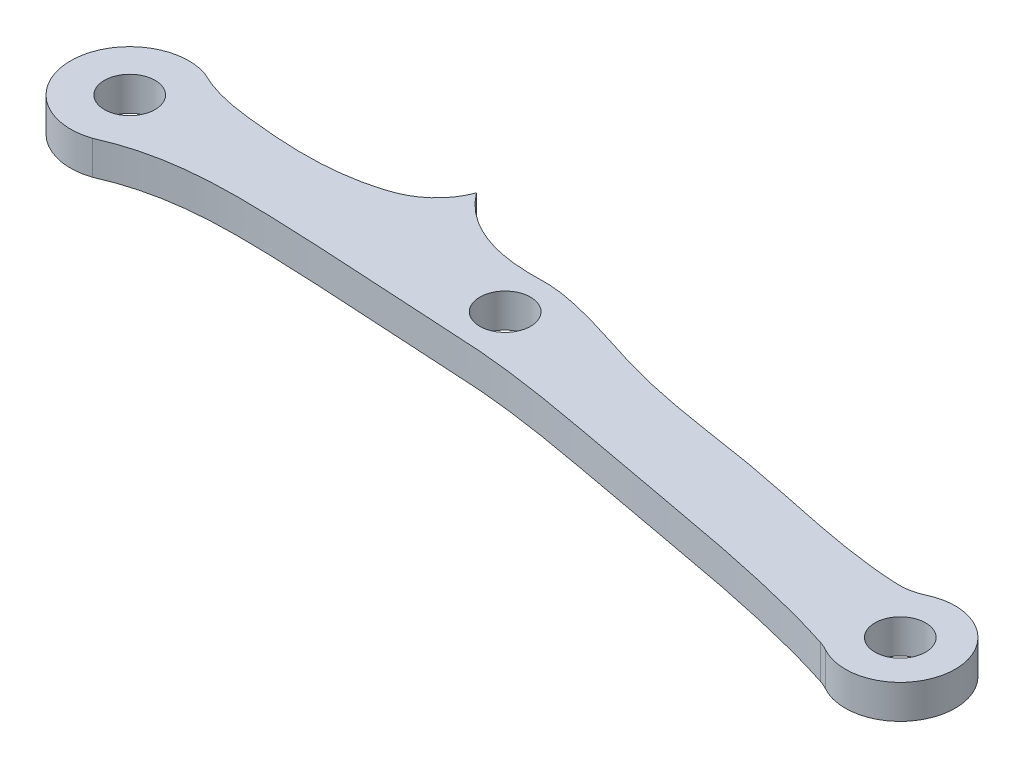
ISO-10303-21;
HEADER;
FILE_DESCRIPTION(('STEP AP214'),'2;1');
FILE_NAME('part.step','',(''),(''),'','','');
FILE_SCHEMA(('AUTOMOTIVE_DESIGN { 1 0 10303 214 1 1 1 1 }'));
ENDSEC;
DATA;
#1=APPLICATION_CONTEXT('core data for automotive mechanical design processes');
#2=APPLICATION_PROTOCOL_DEFINITION('international standard','automotive_design',2000,#1);
#3=PRODUCT_CONTEXT('',#1,'mechanical');
#4=PRODUCT('Part','Part','',(#3));
#5=PRODUCT_RELATED_PRODUCT_CATEGORY('part','',(#4));
#6=PRODUCT_DEFINITION_FORMATION('','',#4);
#7=PRODUCT_DEFINITION_CONTEXT('part definition',#1,'design');
#8=PRODUCT_DEFINITION('design','',#6,#7);
#9=PRODUCT_DEFINITION_SHAPE('','',#8);
#10=(LENGTH_UNIT() NAMED_UNIT(*) SI_UNIT(.MILLI.,.METRE.));
#11=(NAMED_UNIT(*) PLANE_ANGLE_UNIT() SI_UNIT($,.RADIAN.));
#12=(NAMED_UNIT(*) SI_UNIT($,.STERADIAN.) SOLID_ANGLE_UNIT());
#13=UNCERTAINTY_MEASURE_WITH_UNIT(LENGTH_MEASURE(1.E-05),#10,'distance_accuracy_value','');
#14=(GEOMETRIC_REPRESENTATION_CONTEXT(3) GLOBAL_UNCERTAINTY_ASSIGNED_CONTEXT((#13)) GLOBAL_UNIT_ASSIGNED_CONTEXT((#10,
#11,#12)) REPRESENTATION_CONTEXT('',''));
#15=CARTESIAN_POINT('',(0.,0.,0.));
#16=DIRECTION('',(0.,0.,1.));
#17=DIRECTION('',(1.,0.,0.));
#18=AXIS2_PLACEMENT_3D('',#15,#16,#17);
#19=CARTESIAN_POINT('',(0.,20.,0.));
#20=DIRECTION('',(0.,-1.,0.));
#21=DIRECTION('',(0.,0.,-1.));
#22=AXIS2_PLACEMENT_3D('',#19,#20,#21);
#23=CYLINDRICAL_SURFACE('',#22,35.);
#24=CARTESIAN_POINT('',(0.,0.,0.));
#25=DIRECTION('',(0.,1.,0.));
#26=DIRECTION('',(0.,0.,1.));
#27=AXIS2_PLACEMENT_3D('',#24,#25,#26);
#28=CIRCLE('',#27,35.);
#29=CARTESIAN_POINT('',(11.2278449220897,0.,-33.1501960538019));
#30=VERTEX_POINT('',#29);
#31=CARTESIAN_POINT('',(11.2278449220897,0.,33.1501960538019));
#32=VERTEX_POINT('',#31);
#33=EDGE_CURVE('E219',#30,#32,#28,.T.);
#34=ORIENTED_EDGE('',*,*,#33,.T.);
#35=DIRECTION('',(0.,-1.,0.));
#36=VECTOR('',#35,1.);
#37=CARTESIAN_POINT('',(11.2278449220897,20.,33.1501960538019));
#38=LINE('',#37,#36);
#39=CARTESIAN_POINT('',(11.2278449220897,20.,33.1501960538019));
#40=VERTEX_POINT('',#39);
#41=EDGE_CURVE('E11',#40,#32,#38,.T.);
#42=ORIENTED_EDGE('',*,*,#41,.F.);
#43=CARTESIAN_POINT('',(0.,20.,0.));
#44=DIRECTION('',(0.,1.,0.));
#45=DIRECTION('',(0.,0.,1.));
#46=AXIS2_PLACEMENT_3D('',#43,#44,#45);
#47=CIRCLE('',#46,35.);
#48=CARTESIAN_POINT('',(11.2278449220897,20.,-33.1501960538019));
#49=VERTEX_POINT('',#48);
#50=EDGE_CURVE('E181',#49,#40,#47,.T.);
#51=ORIENTED_EDGE('',*,*,#50,.F.);
#52=DIRECTION('',(0.,-1.,0.));
#53=VECTOR('',#52,1.);
#54=CARTESIAN_POINT('',(11.2278449220897,20.,-33.1501960538019));
#55=LINE('',#54,#53);
#56=EDGE_CURVE('E65',#49,#30,#55,.T.);
#57=ORIENTED_EDGE('',*,*,#56,.T.);
#58=EDGE_LOOP('',(#34,#42,#51,#57));
#59=FACE_BOUND('',#58,.T.);
#60=ADVANCED_FACE('F47',(#59),#23,.T.);
#61=CARTESIAN_POINT('',(11.2278449220897,20.,33.1501960538019));
#62=CARTESIAN_POINT('',(41.4167565536691,20.,19.5458087174127));
#63=CARTESIAN_POINT('',(109.617018014727,20.,19.5943513866573));
#64=CARTESIAN_POINT('',(185.82372038496,20.,25.1065613653826));
#65=CARTESIAN_POINT('',(260.889286260654,20.,28.7263373929466));
#66=CARTESIAN_POINT('',(314.998938133145,20.,40.1034737505354));
#67=CARTESIAN_POINT('',(397.029783507844,20.,54.5301468518699));
#68=CARTESIAN_POINT('',(449.771483959378,20.,64.7244108950254));
#69=CARTESIAN_POINT('',(484.590684969114,20.,76.1256831889839));
#70=B_SPLINE_CURVE_WITH_KNOTS('',3,(#61,#62,#63,#64,#65,#66,#67,#68,#69),.UNSPECIFIED.,.F.,.F.,
(4,1,1,1,1,1,4),(0.,0.199281033354488,0.40819670319934,0.458288105144164,0.673316503062886,
0.728275547660917,0.981000001384637),.UNSPECIFIED.);
#71=DIRECTION('',(0.,-1.,0.));
#72=VECTOR('',#71,1.);
#73=SURFACE_OF_LINEAR_EXTRUSION('',#70,#72);
#74=CARTESIAN_POINT('',(11.2278449220897,0.,33.1501960538019));
#75=CARTESIAN_POINT('',(41.4167565536691,0.,19.5458087174127));
#76=CARTESIAN_POINT('',(109.617018014727,0.,19.5943513866573));
#77=CARTESIAN_POINT('',(185.82372038496,0.,25.1065613653826));
#78=CARTESIAN_POINT('',(260.889286260654,0.,28.7263373929466));
#79=CARTESIAN_POINT('',(314.998938133145,0.,40.1034737505354));
#80=CARTESIAN_POINT('',(397.029783507844,0.,54.5301468518699));
#81=CARTESIAN_POINT('',(449.771483959378,0.,64.7244108950254));
#82=CARTESIAN_POINT('',(484.590684969114,0.,76.1256831889839));
#83=B_SPLINE_CURVE_WITH_KNOTS('',3,(#74,#75,#76,#77,#78,#79,#80,#81,#82),.UNSPECIFIED.,.F.,.F.,
(4,1,1,1,1,1,4),(0.,0.199281033354488,0.40819670319934,0.458288105144164,0.673316503062886,
0.728275547660917,0.981000001384637),.UNSPECIFIED.);
#84=CARTESIAN_POINT('',(484.590684969114,0.,76.125683188984));
#85=VERTEX_POINT('',#84);
#86=EDGE_CURVE('E216',#32,#85,#83,.T.);
#87=ORIENTED_EDGE('',*,*,#86,.T.);
#88=DIRECTION('',(0.,-1.,0.));
#89=VECTOR('',#88,1.);
#90=CARTESIAN_POINT('',(484.590684969114,20.,76.125683188984));
#91=LINE('',#90,#89);
#92=CARTESIAN_POINT('',(484.590684969114,20.,76.125683188984));
#93=VERTEX_POINT('',#92);
#94=EDGE_CURVE('E57',#93,#85,#91,.T.);
#95=ORIENTED_EDGE('',*,*,#94,.F.);
#96=EDGE_CURVE('E100',#40,#93,#70,.T.);
#97=ORIENTED_EDGE('',*,*,#96,.F.);
#98=ORIENTED_EDGE('',*,*,#41,.T.);
#99=EDGE_LOOP('',(#87,#95,#97,#98));
#100=FACE_BOUND('',#99,.T.);
#101=ADVANCED_FACE('F168',(#100),#73,.F.);
#102=CARTESIAN_POINT('',(475.25515154402,20.,104.636169254096));
#103=DIRECTION('',(0.,-1.,0.));
#104=DIRECTION('',(0.,0.,-1.));
#105=AXIS2_PLACEMENT_3D('',#102,#103,#104);
#106=CYLINDRICAL_SURFACE('',#105,30.);
#107=CARTESIAN_POINT('',(475.25515154402,0.,104.636169254096));
#108=DIRECTION('',(0.,1.,0.));
#109=DIRECTION('',(0.,0.,1.));
#110=AXIS2_PLACEMENT_3D('',#107,#108,#109);
#111=CIRCLE('',#110,30.);
#112=CARTESIAN_POINT('',(489.832502579298,0.,78.4159320928065));
#113=VERTEX_POINT('',#112);
#114=EDGE_CURVE('E213',#85,#113,#111,.F.);
#115=ORIENTED_EDGE('',*,*,#114,.T.);
#116=DIRECTION('',(0.,-1.,0.));
#117=VECTOR('',#116,1.);
#118=CARTESIAN_POINT('',(489.832502579298,20.,78.4159320928065));
#119=LINE('',#118,#117);
#120=CARTESIAN_POINT('',(489.832502579298,20.,78.4159320928065));
#121=VERTEX_POINT('',#120);
#122=EDGE_CURVE('E257',#121,#113,#119,.T.);
#123=ORIENTED_EDGE('',*,*,#122,.F.);
#124=CARTESIAN_POINT('',(475.25515154402,20.,104.636169254096));
#125=DIRECTION('',(0.,1.,0.));
#126=DIRECTION('',(0.,0.,1.));
#127=AXIS2_PLACEMENT_3D('',#124,#125,#126);
#128=CIRCLE('',#127,30.);
#129=EDGE_CURVE('E180',#93,#121,#128,.F.);
#130=ORIENTED_EDGE('',*,*,#129,.F.);
#131=ORIENTED_EDGE('',*,*,#94,.T.);
#132=EDGE_LOOP('',(#115,#123,#130,#131));
#133=FACE_BOUND('',#132,.T.);
#134=ADVANCED_FACE('F164',(#133),#106,.F.);
#135=CARTESIAN_POINT('',(505.624632867516,20.,50.010675168076));
#136=DIRECTION('',(0.,-1.,0.));
#137=DIRECTION('',(0.,0.,-1.));
#138=AXIS2_PLACEMENT_3D('',#135,#136,#137);
#139=CYLINDRICAL_SURFACE('',#138,32.4999999999999);
#140=CARTESIAN_POINT('',(505.624632867516,0.,50.010675168076));
#141=DIRECTION('',(0.,1.,0.));
#142=DIRECTION('',(0.,0.,1.));
#143=AXIS2_PLACEMENT_3D('',#140,#141,#142);
#144=CIRCLE('',#143,32.4999999999999);
#145=CARTESIAN_POINT('',(491.671127052918,0.,20.658508715121));
#146=VERTEX_POINT('',#145);
#147=EDGE_CURVE('E209',#113,#146,#144,.T.);
#148=ORIENTED_EDGE('',*,*,#147,.T.);
#149=DIRECTION('',(0.,-1.,0.));
#150=VECTOR('',#149,1.);
#151=CARTESIAN_POINT('',(491.671127052918,20.,20.658508715121));
#152=LINE('',#151,#150);
#153=CARTESIAN_POINT('',(491.671127052918,20.,20.658508715121));
#154=VERTEX_POINT('',#153);
#155=EDGE_CURVE('E123',#154,#146,#152,.T.);
#156=ORIENTED_EDGE('',*,*,#155,.F.);
#157=CARTESIAN_POINT('',(505.624632867516,20.,50.010675168076));
#158=DIRECTION('',(0.,1.,0.));
#159=DIRECTION('',(0.,0.,1.));
#160=AXIS2_PLACEMENT_3D('',#157,#158,#159);
#161=CIRCLE('',#160,32.4999999999999);
#162=EDGE_CURVE('E131',#121,#154,#161,.T.);
#163=ORIENTED_EDGE('',*,*,#162,.F.);
#164=ORIENTED_EDGE('',*,*,#122,.T.);
#165=EDGE_LOOP('',(#148,#156,#163,#164));
#166=FACE_BOUND('',#165,.T.);
#167=ADVANCED_FACE('F161',(#166),#139,.T.);
#168=CARTESIAN_POINT('',(478.790967839443,20.,-6.43579877991446));
#169=DIRECTION('',(0.,-1.,0.));
#170=DIRECTION('',(0.,0.,-1.));
#171=AXIS2_PLACEMENT_3D('',#168,#169,#170);
#172=CYLINDRICAL_SURFACE('',#171,30.);
#173=CARTESIAN_POINT('',(478.790967839443,0.,-6.43579877991446));
#174=DIRECTION('',(0.,1.,0.));
#175=DIRECTION('',(0.,0.,1.));
#176=AXIS2_PLACEMENT_3D('',#173,#174,#175);
#177=CIRCLE('',#176,30.);
#178=CARTESIAN_POINT('',(477.449535041742,0.,23.534195515201));
#179=VERTEX_POINT('',#178);
#180=EDGE_CURVE('E118',#179,#146,#177,.T.);
#181=ORIENTED_EDGE('',*,*,#180,.F.);
#182=DIRECTION('',(0.,-1.,0.));
#183=VECTOR('',#182,1.);
#184=CARTESIAN_POINT('',(477.449535041742,20.,23.534195515201));
#185=LINE('',#184,#183);
#186=CARTESIAN_POINT('',(477.449535041742,20.,23.534195515201));
#187=VERTEX_POINT('',#186);
#188=EDGE_CURVE('E113',#187,#179,#185,.T.);
#189=ORIENTED_EDGE('',*,*,#188,.F.);
#190=CARTESIAN_POINT('',(478.790967839443,20.,-6.43579877991446));
#191=DIRECTION('',(0.,1.,0.));
#192=DIRECTION('',(0.,0.,1.));
#193=AXIS2_PLACEMENT_3D('',#190,#191,#192);
#194=CIRCLE('',#193,30.);
#195=EDGE_CURVE('E116',#187,#154,#194,.T.);
#196=ORIENTED_EDGE('',*,*,#195,.T.);
#197=ORIENTED_EDGE('',*,*,#155,.T.);
#198=EDGE_LOOP('',(#181,#189,#196,#197));
#199=FACE_BOUND('',#198,.T.);
#200=ADVANCED_FACE('F115',(#199),#172,.F.);
#201=CARTESIAN_POINT('',(152.569978470431,20.,-52.446429487655));
#202=CARTESIAN_POINT('',(169.216290541094,20.,-30.2513467267702));
#203=CARTESIAN_POINT('',(199.499803962065,20.,-25.9854701687068));
#204=CARTESIAN_POINT('',(229.531039992593,20.,-27.5997398322628));
#205=CARTESIAN_POINT('',(258.115601287071,20.,-19.3712572274807));
#206=CARTESIAN_POINT('',(295.678183930158,20.,-6.78542798163519));
#207=CARTESIAN_POINT('',(325.978973640535,20.,-0.976639678659181));
#208=CARTESIAN_POINT('',(396.041080311098,20.,9.06713512549248));
#209=CARTESIAN_POINT('',(440.032342199847,20.,21.8594321107846));
#210=CARTESIAN_POINT('',(477.449535041742,20.,23.534195515201));
#211=B_SPLINE_CURVE_WITH_KNOTS('',3,(#201,#202,#203,#204,#205,#206,#207,#208,#209,#210),
.UNSPECIFIED.,.F.,.F.,(4,1,1,1,1,1,1,4),(0.,0.156649966692074,0.187428866143182,
0.294415646914651,0.33547383172428,0.556952529429845,0.622371723483351,0.961980935046151),.UNSPECIFIED.);
#212=DIRECTION('',(0.,-1.,0.));
#213=VECTOR('',#212,1.);
#214=SURFACE_OF_LINEAR_EXTRUSION('',#211,#213);
#215=CARTESIAN_POINT('',(152.569978470431,0.,-52.446429487655));
#216=CARTESIAN_POINT('',(169.216290541094,0.,-30.2513467267702));
#217=CARTESIAN_POINT('',(199.499803962065,0.,-25.9854701687068));
#218=CARTESIAN_POINT('',(229.531039992593,0.,-27.5997398322628));
#219=CARTESIAN_POINT('',(258.115601287071,0.,-19.3712572274807));
#220=CARTESIAN_POINT('',(295.678183930158,0.,-6.78542798163519));
#221=CARTESIAN_POINT('',(325.978973640535,0.,-0.976639678659181));
#222=CARTESIAN_POINT('',(396.041080311098,0.,9.06713512549248));
#223=CARTESIAN_POINT('',(440.032342199847,0.,21.8594321107846));
#224=CARTESIAN_POINT('',(477.449535041742,0.,23.534195515201));
#225=B_SPLINE_CURVE_WITH_KNOTS('',3,(#215,#216,#217,#218,#219,#220,#221,#222,#223,#224),
.UNSPECIFIED.,.F.,.F.,(4,1,1,1,1,1,1,4),(0.,0.156649966692074,0.187428866143182,
0.294415646914651,0.33547383172428,0.556952529429845,0.622371723483351,0.961980935046151),.UNSPECIFIED.);
#226=CARTESIAN_POINT('',(152.569978470431,0.,-52.4464294876549));
#227=VERTEX_POINT('',#226);
#228=EDGE_CURVE('E204',#227,#179,#225,.T.);
#229=ORIENTED_EDGE('',*,*,#228,.F.);
#230=DIRECTION('',(0.,-1.,0.));
#231=VECTOR('',#230,1.);
#232=CARTESIAN_POINT('',(152.569978470431,20.,-52.4464294876549));
#233=LINE('',#232,#231);
#234=CARTESIAN_POINT('',(152.569978470431,20.,-52.4464294876549));
#235=VERTEX_POINT('',#234);
#236=EDGE_CURVE('E88',#235,#227,#233,.T.);
#237=ORIENTED_EDGE('',*,*,#236,.F.);
#238=EDGE_CURVE('E129',#235,#187,#211,.T.);
#239=ORIENTED_EDGE('',*,*,#238,.T.);
#240=ORIENTED_EDGE('',*,*,#188,.T.);
#241=EDGE_LOOP('',(#229,#237,#239,#240));
#242=FACE_BOUND('',#241,.T.);
#243=ADVANCED_FACE('F135',(#242),#214,.T.);
#244=CARTESIAN_POINT('',(0.,20.,0.));
#245=DIRECTION('',(0.,-1.,0.));
#246=DIRECTION('',(0.,0.,-1.));
#247=AXIS2_PLACEMENT_3D('',#244,#245,#246);
#248=CYLINDRICAL_SURFACE('',#247,15.);
#249=CARTESIAN_POINT('',(0.,20.,0.));
#250=DIRECTION('',(0.,1.,0.));
#251=DIRECTION('',(0.,0.,1.));
#252=AXIS2_PLACEMENT_3D('',#249,#250,#251);
#253=CIRCLE('',#252,15.);
#254=CARTESIAN_POINT('',(0.,20.,15.));
#255=VERTEX_POINT('',#254);
#256=EDGE_CURVE('E190',#255,#255,#253,.T.);
#257=ORIENTED_EDGE('',*,*,#256,.T.);
#258=EDGE_LOOP('',(#257));
#259=FACE_BOUND('',#258,.T.);
#260=CARTESIAN_POINT('',(0.,0.,0.));
#261=DIRECTION('',(0.,1.,0.));
#262=DIRECTION('',(0.,0.,1.));
#263=AXIS2_PLACEMENT_3D('',#260,#261,#262);
#264=CIRCLE('',#263,15.);
#265=CARTESIAN_POINT('',(0.,0.,15.));
#266=VERTEX_POINT('',#265);
#267=EDGE_CURVE('E222',#266,#266,#264,.T.);
#268=ORIENTED_EDGE('',*,*,#267,.F.);
#269=EDGE_LOOP('',(#268));
#270=FACE_BOUND('',#269,.T.);
#271=ADVANCED_FACE('F156',(#259,#270),#248,.F.);
#272=CARTESIAN_POINT('',(222.,20.,0.));
#273=DIRECTION('',(0.,-1.,0.));
#274=DIRECTION('',(0.,0.,-1.));
#275=AXIS2_PLACEMENT_3D('',#272,#273,#274);
#276=CYLINDRICAL_SURFACE('',#275,15.);
#277=CARTESIAN_POINT('',(222.,20.,0.));
#278=DIRECTION('',(0.,1.,0.));
#279=DIRECTION('',(0.,0.,1.));
#280=AXIS2_PLACEMENT_3D('',#277,#278,#279);
#281=CIRCLE('',#280,15.);
#282=CARTESIAN_POINT('',(222.,20.,15.));
#283=VERTEX_POINT('',#282);
#284=EDGE_CURVE('E193',#283,#283,#281,.T.);
#285=ORIENTED_EDGE('',*,*,#284,.T.);
#286=EDGE_LOOP('',(#285));
#287=FACE_BOUND('',#286,.T.);
#288=CARTESIAN_POINT('',(222.,0.,0.));
#289=DIRECTION('',(0.,1.,0.));
#290=DIRECTION('',(0.,0.,1.));
#291=AXIS2_PLACEMENT_3D('',#288,#289,#290);
#292=CIRCLE('',#291,15.);
#293=CARTESIAN_POINT('',(222.,0.,15.));
#294=VERTEX_POINT('',#293);
#295=EDGE_CURVE('E226',#294,#294,#292,.T.);
#296=ORIENTED_EDGE('',*,*,#295,.F.);
#297=EDGE_LOOP('',(#296));
#298=FACE_BOUND('',#297,.T.);
#299=ADVANCED_FACE('F275',(#287,#298),#276,.F.);
#300=CARTESIAN_POINT('',(505.624632867516,20.,50.010675168076));
#301=DIRECTION('',(0.,-1.,0.));
#302=DIRECTION('',(0.,0.,-1.));
#303=AXIS2_PLACEMENT_3D('',#300,#301,#302);
#304=CYLINDRICAL_SURFACE('',#303,15.);
#305=CARTESIAN_POINT('',(505.624632867516,20.,50.010675168076));
#306=DIRECTION('',(0.,1.,0.));
#307=DIRECTION('',(0.,0.,1.));
#308=AXIS2_PLACEMENT_3D('',#305,#306,#307);
#309=CIRCLE('',#308,15.);
#310=CARTESIAN_POINT('',(505.624632867516,20.,65.010675168076));
#311=VERTEX_POINT('',#310);
#312=EDGE_CURVE('E196',#311,#311,#309,.T.);
#313=ORIENTED_EDGE('',*,*,#312,.T.);
#314=EDGE_LOOP('',(#313));
#315=FACE_BOUND('',#314,.T.);
#316=CARTESIAN_POINT('',(505.624632867516,0.,50.010675168076));
#317=DIRECTION('',(0.,1.,0.));
#318=DIRECTION('',(0.,0.,1.));
#319=AXIS2_PLACEMENT_3D('',#316,#317,#318);
#320=CIRCLE('',#319,15.);
#321=CARTESIAN_POINT('',(505.624632867516,0.,65.010675168076));
#322=VERTEX_POINT('',#321);
#323=EDGE_CURVE('E230',#322,#322,#320,.T.);
#324=ORIENTED_EDGE('',*,*,#323,.F.);
#325=EDGE_LOOP('',(#324));
#326=FACE_BOUND('',#325,.T.);
#327=ADVANCED_FACE('F49',(#315,#326),#304,.F.);
#328=CARTESIAN_POINT('',(11.2278449220897,20.,-33.1501960538019));
#329=CARTESIAN_POINT('',(24.9358873179833,20.,-26.1256486329396));
#330=CARTESIAN_POINT('',(59.9255790197058,20.,-21.305654622714));
#331=CARTESIAN_POINT('',(100.800901738883,20.,-19.3911683204402));
#332=CARTESIAN_POINT('',(138.449474198914,20.,-31.2641375404554));
#333=CARTESIAN_POINT('',(149.180734347437,20.,-42.6590217656698));
#334=CARTESIAN_POINT('',(152.569978470431,20.,-52.4464294876549));
#335=B_SPLINE_CURVE_WITH_KNOTS('',3,(#328,#329,#330,#331,#332,#333,#334),.UNSPECIFIED.,.F.,.F.,
(4,1,1,1,4),(0.,0.279361214419867,0.721038744393087,0.798623592075766,1.),.UNSPECIFIED.);
#336=DIRECTION('',(0.,-1.,0.));
#337=VECTOR('',#336,1.);
#338=SURFACE_OF_LINEAR_EXTRUSION('',#335,#337);
#339=CARTESIAN_POINT('',(11.2278449220897,0.,-33.1501960538019));
#340=CARTESIAN_POINT('',(24.9358873179833,0.,-26.1256486329396));
#341=CARTESIAN_POINT('',(59.9255790197058,0.,-21.305654622714));
#342=CARTESIAN_POINT('',(100.800901738883,0.,-19.3911683204402));
#343=CARTESIAN_POINT('',(138.449474198914,0.,-31.2641375404554));
#344=CARTESIAN_POINT('',(149.180734347437,0.,-42.6590217656698));
#345=CARTESIAN_POINT('',(152.569978470431,0.,-52.4464294876549));
#346=B_SPLINE_CURVE_WITH_KNOTS('',3,(#339,#340,#341,#342,#343,#344,#345),.UNSPECIFIED.,.F.,.F.,
(4,1,1,1,4),(0.,0.279361214419867,0.721038744393087,0.798623592075766,1.),.UNSPECIFIED.);
#347=EDGE_CURVE('E200',#30,#227,#346,.T.);
#348=ORIENTED_EDGE('',*,*,#347,.F.);
#349=ORIENTED_EDGE('',*,*,#56,.F.);
#350=EDGE_CURVE('E137',#49,#235,#335,.T.);
#351=ORIENTED_EDGE('',*,*,#350,.T.);
#352=ORIENTED_EDGE('',*,*,#236,.T.);
#353=EDGE_LOOP('',(#348,#349,#351,#352));
#354=FACE_BOUND('',#353,.T.);
#355=ADVANCED_FACE('F157',(#354),#338,.T.);
#356=CARTESIAN_POINT('',(0.,20.,0.));
#357=DIRECTION('',(0.,1.,0.));
#358=DIRECTION('',(0.,0.,1.));
#359=AXIS2_PLACEMENT_3D('',#356,#357,#358);
#360=PLANE('',#359);
#361=ORIENTED_EDGE('',*,*,#312,.F.);
#362=EDGE_LOOP('',(#361));
#363=FACE_BOUND('',#362,.T.);
#364=ORIENTED_EDGE('',*,*,#284,.F.);
#365=EDGE_LOOP('',(#364));
#366=FACE_BOUND('',#365,.T.);
#367=ORIENTED_EDGE('',*,*,#256,.F.);
#368=EDGE_LOOP('',(#367));
#369=FACE_BOUND('',#368,.T.);
#370=ORIENTED_EDGE('',*,*,#50,.T.);
#371=ORIENTED_EDGE('',*,*,#96,.T.);
#372=ORIENTED_EDGE('',*,*,#129,.T.);
#373=ORIENTED_EDGE('',*,*,#162,.T.);
#374=ORIENTED_EDGE('',*,*,#195,.F.);
#375=ORIENTED_EDGE('',*,*,#238,.F.);
#376=ORIENTED_EDGE('',*,*,#350,.F.);
#377=EDGE_LOOP('',(#370,#371,#372,#373,#374,#375,#376));
#378=FACE_BOUND('',#377,.T.);
#379=ADVANCED_FACE('F127',(#363,#366,#369,#378),#360,.T.);
#380=CARTESIAN_POINT('',(0.,0.,0.));
#381=DIRECTION('',(0.,1.,0.));
#382=DIRECTION('',(0.,0.,1.));
#383=AXIS2_PLACEMENT_3D('',#380,#381,#382);
#384=PLANE('',#383);
#385=ORIENTED_EDGE('',*,*,#323,.T.);
#386=EDGE_LOOP('',(#385));
#387=FACE_BOUND('',#386,.T.);
#388=ORIENTED_EDGE('',*,*,#295,.T.);
#389=EDGE_LOOP('',(#388));
#390=FACE_BOUND('',#389,.T.);
#391=ORIENTED_EDGE('',*,*,#267,.T.);
#392=EDGE_LOOP('',(#391));
#393=FACE_BOUND('',#392,.T.);
#394=ORIENTED_EDGE('',*,*,#33,.F.);
#395=ORIENTED_EDGE('',*,*,#347,.T.);
#396=ORIENTED_EDGE('',*,*,#228,.T.);
#397=ORIENTED_EDGE('',*,*,#180,.T.);
#398=ORIENTED_EDGE('',*,*,#147,.F.);
#399=ORIENTED_EDGE('',*,*,#114,.F.);
#400=ORIENTED_EDGE('',*,*,#86,.F.);
#401=EDGE_LOOP('',(#394,#395,#396,#397,#398,#399,#400));
#402=FACE_BOUND('',#401,.T.);
#403=ADVANCED_FACE('F267',(#387,#390,#393,#402),#384,.F.);
#404=CLOSED_SHELL('',(#60,#101,#134,#167,#200,#243,#271,#299,#327,#355,#379,#403));
#405=MANIFOLD_SOLID_BREP('B2',#404);
#406=ADVANCED_BREP_SHAPE_REPRESENTATION('',(#18,#405),#14);
#407=SHAPE_DEFINITION_REPRESENTATION(#9,#406);
ENDSEC;
END-ISO-10303-21;
